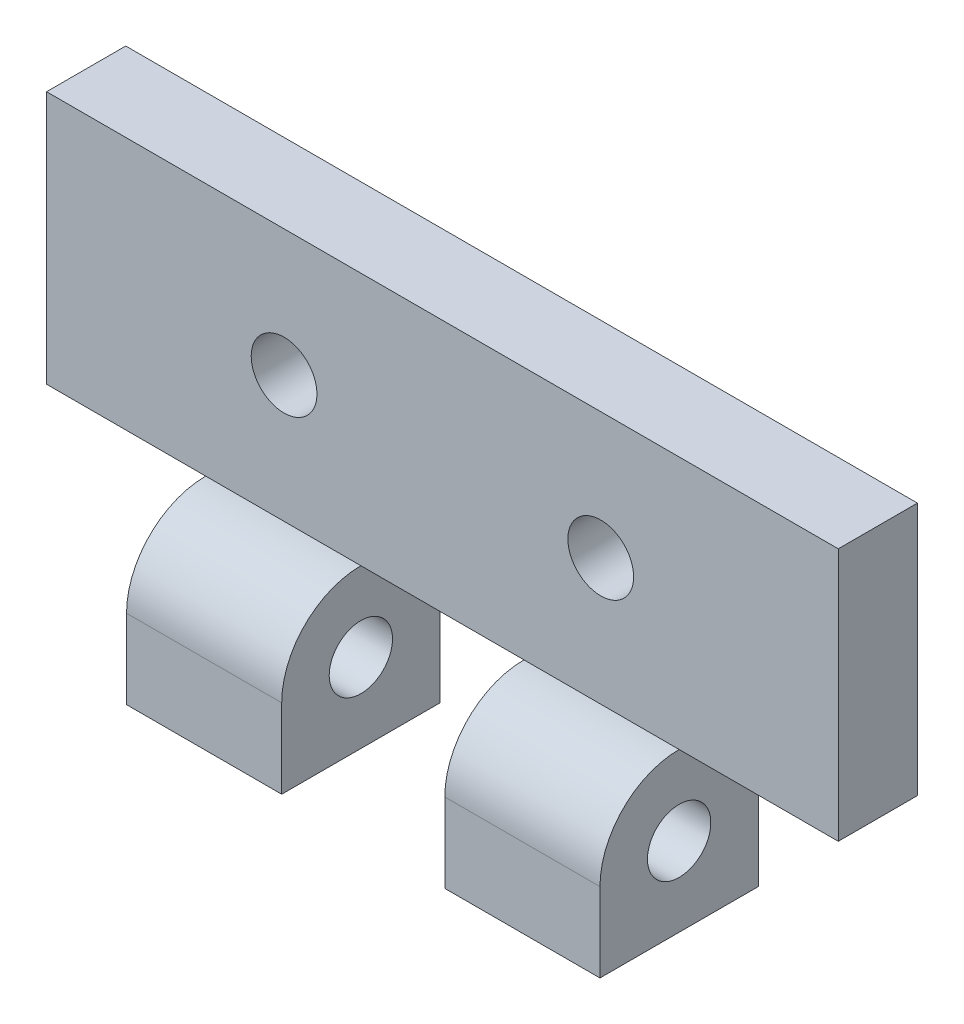
ISO-10303-21;
HEADER;
FILE_DESCRIPTION(('STEP AP214'),'2;1');
FILE_NAME('part.step','',(''),(''),'','','');
FILE_SCHEMA(('AUTOMOTIVE_DESIGN { 1 0 10303 214 1 1 1 1 }'));
ENDSEC;
DATA;
#1=APPLICATION_CONTEXT('core data for automotive mechanical design processes');
#2=APPLICATION_PROTOCOL_DEFINITION('international standard','automotive_design',2000,#1);
#3=PRODUCT_CONTEXT('',#1,'mechanical');
#4=PRODUCT('Part','Part','',(#3));
#5=PRODUCT_RELATED_PRODUCT_CATEGORY('part','',(#4));
#6=PRODUCT_DEFINITION_FORMATION('','',#4);
#7=PRODUCT_DEFINITION_CONTEXT('part definition',#1,'design');
#8=PRODUCT_DEFINITION('design','',#6,#7);
#9=PRODUCT_DEFINITION_SHAPE('','',#8);
#10=(LENGTH_UNIT() NAMED_UNIT(*) SI_UNIT(.MILLI.,.METRE.));
#11=(NAMED_UNIT(*) PLANE_ANGLE_UNIT() SI_UNIT($,.RADIAN.));
#12=(NAMED_UNIT(*) SI_UNIT($,.STERADIAN.) SOLID_ANGLE_UNIT());
#13=UNCERTAINTY_MEASURE_WITH_UNIT(LENGTH_MEASURE(1.E-05),#10,'distance_accuracy_value','');
#14=(GEOMETRIC_REPRESENTATION_CONTEXT(3) GLOBAL_UNCERTAINTY_ASSIGNED_CONTEXT((#13)) GLOBAL_UNIT_ASSIGNED_CONTEXT((#10,
#11,#12)) REPRESENTATION_CONTEXT('',''));
#15=CARTESIAN_POINT('',(0.,0.,0.));
#16=DIRECTION('',(0.,0.,1.));
#17=DIRECTION('',(1.,0.,0.));
#18=AXIS2_PLACEMENT_3D('',#15,#16,#17);
#19=CARTESIAN_POINT('',(-114.95,0.,-190.));
#20=DIRECTION('',(1.,0.,0.));
#21=DIRECTION('',(0.,0.,-1.));
#22=AXIS2_PLACEMENT_3D('',#19,#20,#21);
#23=PLANE('',#22);
#24=CARTESIAN_POINT('',(-114.95,5.,-195.));
#25=DIRECTION('',(-1.,0.,0.));
#26=DIRECTION('',(0.,0.,1.));
#27=AXIS2_PLACEMENT_3D('',#24,#25,#26);
#28=CIRCLE('',#27,2.);
#29=CARTESIAN_POINT('',(-114.95,5.,-193.));
#30=VERTEX_POINT('',#29);
#31=EDGE_CURVE('E211',#30,#30,#28,.T.);
#32=ORIENTED_EDGE('',*,*,#31,.F.);
#33=EDGE_LOOP('',(#32));
#34=FACE_BOUND('',#33,.T.);
#35=DIRECTION('',(0.,-1.,0.));
#36=VECTOR('',#35,1.);
#37=CARTESIAN_POINT('',(-114.95,0.,-190.));
#38=LINE('',#37,#36);
#39=CARTESIAN_POINT('',(-114.95,5.00000000000002,-190.));
#40=VERTEX_POINT('',#39);
#41=CARTESIAN_POINT('',(-114.95,0.,-190.));
#42=VERTEX_POINT('',#41);
#43=EDGE_CURVE('E124',#40,#42,#38,.T.);
#44=ORIENTED_EDGE('',*,*,#43,.F.);
#45=CARTESIAN_POINT('',(-114.95,5.,-195.));
#46=DIRECTION('',(1.,0.,0.));
#47=DIRECTION('',(0.,0.,-1.));
#48=AXIS2_PLACEMENT_3D('',#45,#46,#47);
#49=CIRCLE('',#48,5.);
#50=CARTESIAN_POINT('',(-114.95,9.99999999999999,-195.));
#51=VERTEX_POINT('',#50);
#52=EDGE_CURVE('E62',#40,#51,#49,.F.);
#53=ORIENTED_EDGE('',*,*,#52,.T.);
#54=DIRECTION('',(0.,0.,-1.));
#55=VECTOR('',#54,1.);
#56=CARTESIAN_POINT('',(-114.95,10.,-190.));
#57=LINE('',#56,#55);
#58=CARTESIAN_POINT('',(-114.95,10.,-200.));
#59=VERTEX_POINT('',#58);
#60=EDGE_CURVE('E206',#51,#59,#57,.T.);
#61=ORIENTED_EDGE('',*,*,#60,.T.);
#62=DIRECTION('',(0.,-1.,0.));
#63=VECTOR('',#62,1.);
#64=CARTESIAN_POINT('',(-114.95,0.,-200.));
#65=LINE('',#64,#63);
#66=CARTESIAN_POINT('',(-114.95,0.,-200.));
#67=VERTEX_POINT('',#66);
#68=EDGE_CURVE('E290',#59,#67,#65,.T.);
#69=ORIENTED_EDGE('',*,*,#68,.T.);
#70=DIRECTION('',(0.,0.,-1.));
#71=VECTOR('',#70,1.);
#72=CARTESIAN_POINT('',(-114.95,0.,-190.));
#73=LINE('',#72,#71);
#74=EDGE_CURVE('E203',#42,#67,#73,.T.);
#75=ORIENTED_EDGE('',*,*,#74,.F.);
#76=EDGE_LOOP('',(#44,#53,#61,#69,#75));
#77=FACE_BOUND('',#76,.T.);
#78=ADVANCED_FACE('F47',(#34,#77),#23,.F.);
#79=CARTESIAN_POINT('',(-105.15,10.,-190.));
#80=DIRECTION('',(-1.,0.,0.));
#81=DIRECTION('',(0.,0.,1.));
#82=AXIS2_PLACEMENT_3D('',#79,#80,#81);
#83=PLANE('',#82);
#84=CARTESIAN_POINT('',(-105.15,5.,-195.));
#85=DIRECTION('',(-1.,0.,0.));
#86=DIRECTION('',(0.,0.,1.));
#87=AXIS2_PLACEMENT_3D('',#84,#85,#86);
#88=CIRCLE('',#87,2.);
#89=CARTESIAN_POINT('',(-105.15,5.,-193.));
#90=VERTEX_POINT('',#89);
#91=EDGE_CURVE('E280',#90,#90,#88,.T.);
#92=ORIENTED_EDGE('',*,*,#91,.T.);
#93=EDGE_LOOP('',(#92));
#94=FACE_BOUND('',#93,.T.);
#95=DIRECTION('',(0.,0.,-1.));
#96=VECTOR('',#95,1.);
#97=CARTESIAN_POINT('',(-105.15,10.,-190.));
#98=LINE('',#97,#96);
#99=CARTESIAN_POINT('',(-105.15,10.,-195.));
#100=VERTEX_POINT('',#99);
#101=CARTESIAN_POINT('',(-105.15,10.,-200.));
#102=VERTEX_POINT('',#101);
#103=EDGE_CURVE('E198',#100,#102,#98,.T.);
#104=ORIENTED_EDGE('',*,*,#103,.F.);
#105=CARTESIAN_POINT('',(-105.15,5.00000000000002,-195.));
#106=DIRECTION('',(-1.,0.,0.));
#107=DIRECTION('',(0.,0.,1.));
#108=AXIS2_PLACEMENT_3D('',#105,#106,#107);
#109=CIRCLE('',#108,5.);
#110=CARTESIAN_POINT('',(-105.15,5.00000000000002,-190.));
#111=VERTEX_POINT('',#110);
#112=EDGE_CURVE('E243',#100,#111,#109,.F.);
#113=ORIENTED_EDGE('',*,*,#112,.T.);
#114=DIRECTION('',(0.,1.,0.));
#115=VECTOR('',#114,1.);
#116=CARTESIAN_POINT('',(-105.15,10.,-190.));
#117=LINE('',#116,#115);
#118=CARTESIAN_POINT('',(-105.15,0.,-190.));
#119=VERTEX_POINT('',#118);
#120=EDGE_CURVE('E277',#119,#111,#117,.T.);
#121=ORIENTED_EDGE('',*,*,#120,.F.);
#122=DIRECTION('',(0.,0.,-1.));
#123=VECTOR('',#122,1.);
#124=CARTESIAN_POINT('',(-105.15,0.,-190.));
#125=LINE('',#124,#123);
#126=CARTESIAN_POINT('',(-105.15,0.,-200.));
#127=VERTEX_POINT('',#126);
#128=EDGE_CURVE('E200',#119,#127,#125,.T.);
#129=ORIENTED_EDGE('',*,*,#128,.T.);
#130=DIRECTION('',(0.,1.,0.));
#131=VECTOR('',#130,1.);
#132=CARTESIAN_POINT('',(-105.15,10.,-200.));
#133=LINE('',#132,#131);
#134=EDGE_CURVE('E246',#127,#102,#133,.T.);
#135=ORIENTED_EDGE('',*,*,#134,.T.);
#136=EDGE_LOOP('',(#104,#113,#121,#129,#135));
#137=FACE_BOUND('',#136,.T.);
#138=ADVANCED_FACE('F241',(#94,#137),#83,.F.);
#139=CARTESIAN_POINT('',(-94.8499999999999,0.,-190.));
#140=DIRECTION('',(1.,0.,0.));
#141=DIRECTION('',(0.,0.,-1.));
#142=AXIS2_PLACEMENT_3D('',#139,#140,#141);
#143=PLANE('',#142);
#144=CARTESIAN_POINT('',(-94.8499999999999,5.,-195.));
#145=DIRECTION('',(1.,0.,0.));
#146=DIRECTION('',(0.,0.,-1.));
#147=AXIS2_PLACEMENT_3D('',#144,#145,#146);
#148=CIRCLE('',#147,2.);
#149=CARTESIAN_POINT('',(-94.8499999999999,5.,-197.));
#150=VERTEX_POINT('',#149);
#151=EDGE_CURVE('E210',#150,#150,#148,.T.);
#152=ORIENTED_EDGE('',*,*,#151,.T.);
#153=EDGE_LOOP('',(#152));
#154=FACE_BOUND('',#153,.T.);
#155=DIRECTION('',(0.,-1.,0.));
#156=VECTOR('',#155,1.);
#157=CARTESIAN_POINT('',(-94.8499999999999,0.,-190.));
#158=LINE('',#157,#156);
#159=CARTESIAN_POINT('',(-94.8499999999999,5.00000000000003,-190.));
#160=VERTEX_POINT('',#159);
#161=CARTESIAN_POINT('',(-94.8499999999999,0.,-190.));
#162=VERTEX_POINT('',#161);
#163=EDGE_CURVE('E284',#160,#162,#158,.T.);
#164=ORIENTED_EDGE('',*,*,#163,.F.);
#165=CARTESIAN_POINT('',(-94.8499999999999,5.00000000000003,-195.));
#166=DIRECTION('',(1.,0.,0.));
#167=DIRECTION('',(0.,0.,-1.));
#168=AXIS2_PLACEMENT_3D('',#165,#166,#167);
#169=CIRCLE('',#168,5.);
#170=CARTESIAN_POINT('',(-94.8499999999999,10.,-195.));
#171=VERTEX_POINT('',#170);
#172=EDGE_CURVE('E301',#160,#171,#169,.F.);
#173=ORIENTED_EDGE('',*,*,#172,.T.);
#174=DIRECTION('',(0.,0.,-1.));
#175=VECTOR('',#174,1.);
#176=CARTESIAN_POINT('',(-94.8499999999999,10.,-190.));
#177=LINE('',#176,#175);
#178=CARTESIAN_POINT('',(-94.8499999999999,10.,-200.));
#179=VERTEX_POINT('',#178);
#180=EDGE_CURVE('E196',#171,#179,#177,.T.);
#181=ORIENTED_EDGE('',*,*,#180,.T.);
#182=DIRECTION('',(0.,-1.,0.));
#183=VECTOR('',#182,1.);
#184=CARTESIAN_POINT('',(-94.8499999999999,0.,-200.));
#185=LINE('',#184,#183);
#186=CARTESIAN_POINT('',(-94.8499999999999,0.,-200.));
#187=VERTEX_POINT('',#186);
#188=EDGE_CURVE('E258',#179,#187,#185,.T.);
#189=ORIENTED_EDGE('',*,*,#188,.T.);
#190=DIRECTION('',(0.,0.,-1.));
#191=VECTOR('',#190,1.);
#192=CARTESIAN_POINT('',(-94.8499999999999,0.,-190.));
#193=LINE('',#192,#191);
#194=EDGE_CURVE('E193',#162,#187,#193,.T.);
#195=ORIENTED_EDGE('',*,*,#194,.F.);
#196=EDGE_LOOP('',(#164,#173,#181,#189,#195));
#197=FACE_BOUND('',#196,.T.);
#198=ADVANCED_FACE('F334',(#154,#197),#143,.F.);
#199=CARTESIAN_POINT('',(-85.0499999999999,10.,-190.));
#200=DIRECTION('',(-1.,0.,0.));
#201=DIRECTION('',(0.,0.,1.));
#202=AXIS2_PLACEMENT_3D('',#199,#200,#201);
#203=PLANE('',#202);
#204=CARTESIAN_POINT('',(-85.0499999999999,5.,-195.));
#205=DIRECTION('',(-1.,0.,0.));
#206=DIRECTION('',(0.,0.,1.));
#207=AXIS2_PLACEMENT_3D('',#204,#205,#206);
#208=CIRCLE('',#207,2.);
#209=CARTESIAN_POINT('',(-85.0499999999999,5.,-193.));
#210=VERTEX_POINT('',#209);
#211=EDGE_CURVE('E208',#210,#210,#208,.T.);
#212=ORIENTED_EDGE('',*,*,#211,.T.);
#213=EDGE_LOOP('',(#212));
#214=FACE_BOUND('',#213,.T.);
#215=DIRECTION('',(0.,0.,-1.));
#216=VECTOR('',#215,1.);
#217=CARTESIAN_POINT('',(-85.0499999999999,10.,-190.));
#218=LINE('',#217,#216);
#219=CARTESIAN_POINT('',(-85.0499999999999,10.,-195.));
#220=VERTEX_POINT('',#219);
#221=CARTESIAN_POINT('',(-85.0499999999999,10.,-200.));
#222=VERTEX_POINT('',#221);
#223=EDGE_CURVE('E188',#220,#222,#218,.T.);
#224=ORIENTED_EDGE('',*,*,#223,.F.);
#225=CARTESIAN_POINT('',(-85.0499999999999,5.00000000000005,-195.));
#226=DIRECTION('',(-1.,0.,0.));
#227=DIRECTION('',(0.,0.,1.));
#228=AXIS2_PLACEMENT_3D('',#225,#226,#227);
#229=CIRCLE('',#228,5.);
#230=CARTESIAN_POINT('',(-85.0499999999999,5.00000000000005,-190.));
#231=VERTEX_POINT('',#230);
#232=EDGE_CURVE('E377',#220,#231,#229,.F.);
#233=ORIENTED_EDGE('',*,*,#232,.T.);
#234=DIRECTION('',(0.,1.,0.));
#235=VECTOR('',#234,1.);
#236=CARTESIAN_POINT('',(-85.0499999999999,10.,-190.));
#237=LINE('',#236,#235);
#238=CARTESIAN_POINT('',(-85.0499999999999,0.,-190.));
#239=VERTEX_POINT('',#238);
#240=EDGE_CURVE('E183',#239,#231,#237,.T.);
#241=ORIENTED_EDGE('',*,*,#240,.F.);
#242=DIRECTION('',(0.,0.,-1.));
#243=VECTOR('',#242,1.);
#244=CARTESIAN_POINT('',(-85.0499999999999,0.,-190.));
#245=LINE('',#244,#243);
#246=CARTESIAN_POINT('',(-85.0499999999999,0.,-200.));
#247=VERTEX_POINT('',#246);
#248=EDGE_CURVE('E190',#239,#247,#245,.T.);
#249=ORIENTED_EDGE('',*,*,#248,.T.);
#250=DIRECTION('',(0.,1.,0.));
#251=VECTOR('',#250,1.);
#252=CARTESIAN_POINT('',(-85.0499999999999,10.,-200.));
#253=LINE('',#252,#251);
#254=EDGE_CURVE('E265',#247,#222,#253,.T.);
#255=ORIENTED_EDGE('',*,*,#254,.T.);
#256=EDGE_LOOP('',(#224,#233,#241,#249,#255));
#257=FACE_BOUND('',#256,.T.);
#258=ADVANCED_FACE('F345',(#214,#257),#203,.F.);
#259=CARTESIAN_POINT('',(0.,0.,-190.));
#260=DIRECTION('',(0.,0.,-1.));
#261=DIRECTION('',(-1.,0.,0.));
#262=AXIS2_PLACEMENT_3D('',#259,#260,#261);
#263=PLANE('',#262);
#264=ORIENTED_EDGE('',*,*,#240,.T.);
#265=DIRECTION('',(-1.,0.,0.));
#266=VECTOR('',#265,1.);
#267=CARTESIAN_POINT('',(0.,5.0000000000002,-190.));
#268=LINE('',#267,#266);
#269=EDGE_CURVE('E11',#231,#160,#268,.T.);
#270=ORIENTED_EDGE('',*,*,#269,.T.);
#271=ORIENTED_EDGE('',*,*,#163,.T.);
#272=DIRECTION('',(1.,0.,0.));
#273=VECTOR('',#272,1.);
#274=CARTESIAN_POINT('',(-85.0499999999999,0.,-190.));
#275=LINE('',#274,#273);
#276=EDGE_CURVE('E71',#162,#239,#275,.T.);
#277=ORIENTED_EDGE('',*,*,#276,.T.);
#278=EDGE_LOOP('',(#264,#270,#271,#277));
#279=FACE_BOUND('',#278,.T.);
#280=ADVANCED_FACE('F352',(#279),#263,.F.);
#281=CARTESIAN_POINT('',(-114.95,10.,-190.));
#282=DIRECTION('',(0.,1.,0.));
#283=DIRECTION('',(0.,0.,1.));
#284=AXIS2_PLACEMENT_3D('',#281,#282,#283);
#285=PLANE('',#284);
#286=ORIENTED_EDGE('',*,*,#60,.F.);
#287=DIRECTION('',(-1.,0.,0.));
#288=VECTOR('',#287,1.);
#289=CARTESIAN_POINT('',(-71.,10.0000000000001,-195.));
#290=LINE('',#289,#288);
#291=CARTESIAN_POINT('',(-125.,9.99999999999997,-195.));
#292=VERTEX_POINT('',#291);
#293=EDGE_CURVE('E168',#51,#292,#290,.T.);
#294=ORIENTED_EDGE('',*,*,#293,.T.);
#295=DIRECTION('',(0.,0.,-1.));
#296=VECTOR('',#295,1.);
#297=CARTESIAN_POINT('',(-125.,10.,-190.));
#298=LINE('',#297,#296);
#299=CARTESIAN_POINT('',(-125.,10.,-200.));
#300=VERTEX_POINT('',#299);
#301=EDGE_CURVE('E117',#292,#300,#298,.T.);
#302=ORIENTED_EDGE('',*,*,#301,.T.);
#303=DIRECTION('',(1.,0.,0.));
#304=VECTOR('',#303,1.);
#305=CARTESIAN_POINT('',(-114.95,10.,-200.));
#306=LINE('',#305,#304);
#307=EDGE_CURVE('E288',#300,#59,#306,.T.);
#308=ORIENTED_EDGE('',*,*,#307,.T.);
#309=EDGE_LOOP('',(#286,#294,#302,#308));
#310=FACE_BOUND('',#309,.T.);
#311=ADVANCED_FACE('F49',(#310),#285,.F.);
#312=CARTESIAN_POINT('',(-105.15,0.,-190.));
#313=DIRECTION('',(0.,1.,0.));
#314=DIRECTION('',(-1.,0.,0.));
#315=AXIS2_PLACEMENT_3D('',#312,#313,#314);
#316=PLANE('',#315);
#317=DIRECTION('',(1.,0.,0.));
#318=VECTOR('',#317,1.);
#319=CARTESIAN_POINT('',(-105.15,0.,-200.));
#320=LINE('',#319,#318);
#321=EDGE_CURVE('E252',#67,#127,#320,.T.);
#322=ORIENTED_EDGE('',*,*,#321,.T.);
#323=ORIENTED_EDGE('',*,*,#128,.F.);
#324=DIRECTION('',(1.,0.,0.));
#325=VECTOR('',#324,1.);
#326=CARTESIAN_POINT('',(-105.15,0.,-190.));
#327=LINE('',#326,#325);
#328=EDGE_CURVE('E275',#42,#119,#327,.T.);
#329=ORIENTED_EDGE('',*,*,#328,.F.);
#330=ORIENTED_EDGE('',*,*,#74,.T.);
#331=EDGE_LOOP('',(#322,#323,#329,#330));
#332=FACE_BOUND('',#331,.T.);
#333=ADVANCED_FACE('F292',(#332),#316,.F.);
#334=CARTESIAN_POINT('',(-94.8499999999999,10.,-190.));
#335=DIRECTION('',(0.,1.,0.));
#336=DIRECTION('',(0.,0.,1.));
#337=AXIS2_PLACEMENT_3D('',#334,#335,#336);
#338=PLANE('',#337);
#339=ORIENTED_EDGE('',*,*,#180,.F.);
#340=EDGE_CURVE('E227',#171,#100,#290,.T.);
#341=ORIENTED_EDGE('',*,*,#340,.T.);
#342=ORIENTED_EDGE('',*,*,#103,.T.);
#343=DIRECTION('',(1.,0.,0.));
#344=VECTOR('',#343,1.);
#345=CARTESIAN_POINT('',(-94.8499999999999,10.,-200.));
#346=LINE('',#345,#344);
#347=EDGE_CURVE('E251',#102,#179,#346,.T.);
#348=ORIENTED_EDGE('',*,*,#347,.T.);
#349=EDGE_LOOP('',(#339,#341,#342,#348));
#350=FACE_BOUND('',#349,.T.);
#351=ADVANCED_FACE('F235',(#350),#338,.F.);
#352=CARTESIAN_POINT('',(-85.0499999999999,0.,-190.));
#353=DIRECTION('',(0.,1.,0.));
#354=DIRECTION('',(-1.,0.,0.));
#355=AXIS2_PLACEMENT_3D('',#352,#353,#354);
#356=PLANE('',#355);
#357=DIRECTION('',(1.,0.,0.));
#358=VECTOR('',#357,1.);
#359=CARTESIAN_POINT('',(-85.0499999999999,0.,-200.));
#360=LINE('',#359,#358);
#361=EDGE_CURVE('E260',#187,#247,#360,.T.);
#362=ORIENTED_EDGE('',*,*,#361,.T.);
#363=ORIENTED_EDGE('',*,*,#248,.F.);
#364=ORIENTED_EDGE('',*,*,#276,.F.);
#365=ORIENTED_EDGE('',*,*,#194,.T.);
#366=EDGE_LOOP('',(#362,#363,#364,#365));
#367=FACE_BOUND('',#366,.T.);
#368=ADVANCED_FACE('F342',(#367),#356,.F.);
#369=CARTESIAN_POINT('',(-74.9999999999999,10.,-190.));
#370=DIRECTION('',(0.,1.,0.));
#371=DIRECTION('',(0.,0.,1.));
#372=AXIS2_PLACEMENT_3D('',#369,#370,#371);
#373=PLANE('',#372);
#374=DIRECTION('',(0.,0.,-1.));
#375=VECTOR('',#374,1.);
#376=CARTESIAN_POINT('',(-74.9999999999999,10.,-190.));
#377=LINE('',#376,#375);
#378=CARTESIAN_POINT('',(-74.9999999999999,10.0000000000001,-195.));
#379=VERTEX_POINT('',#378);
#380=CARTESIAN_POINT('',(-74.9999999999999,10.,-200.));
#381=VERTEX_POINT('',#380);
#382=EDGE_CURVE('E181',#379,#381,#377,.T.);
#383=ORIENTED_EDGE('',*,*,#382,.F.);
#384=EDGE_CURVE('E215',#379,#220,#290,.T.);
#385=ORIENTED_EDGE('',*,*,#384,.T.);
#386=ORIENTED_EDGE('',*,*,#223,.T.);
#387=DIRECTION('',(1.,0.,0.));
#388=VECTOR('',#387,1.);
#389=CARTESIAN_POINT('',(-74.9999999999999,10.,-200.));
#390=LINE('',#389,#388);
#391=EDGE_CURVE('E268',#222,#381,#390,.T.);
#392=ORIENTED_EDGE('',*,*,#391,.T.);
#393=EDGE_LOOP('',(#383,#385,#386,#392));
#394=FACE_BOUND('',#393,.T.);
#395=ADVANCED_FACE('F348',(#394),#373,.F.);
#396=CARTESIAN_POINT('',(-74.9999999999999,10.,-190.));
#397=DIRECTION('',(-1.,0.,0.));
#398=DIRECTION('',(0.,-1.,0.));
#399=AXIS2_PLACEMENT_3D('',#396,#397,#398);
#400=PLANE('',#399);
#401=DIRECTION('',(0.,0.,-1.));
#402=VECTOR('',#401,1.);
#403=CARTESIAN_POINT('',(-75.,26.,-190.));
#404=LINE('',#403,#402);
#405=CARTESIAN_POINT('',(-75.,26.0000000000001,-195.));
#406=VERTEX_POINT('',#405);
#407=CARTESIAN_POINT('',(-75.,26.,-200.));
#408=VERTEX_POINT('',#407);
#409=EDGE_CURVE('E179',#406,#408,#404,.T.);
#410=ORIENTED_EDGE('',*,*,#409,.F.);
#411=DIRECTION('',(0.,-1.,0.));
#412=VECTOR('',#411,1.);
#413=CARTESIAN_POINT('',(-74.9999999999999,10.,-195.));
#414=LINE('',#413,#412);
#415=EDGE_CURVE('E164',#406,#379,#414,.T.);
#416=ORIENTED_EDGE('',*,*,#415,.T.);
#417=ORIENTED_EDGE('',*,*,#382,.T.);
#418=DIRECTION('',(0.,1.,0.));
#419=VECTOR('',#418,1.);
#420=CARTESIAN_POINT('',(-74.9999999999999,10.,-200.));
#421=LINE('',#420,#419);
#422=EDGE_CURVE('E271',#381,#408,#421,.T.);
#423=ORIENTED_EDGE('',*,*,#422,.T.);
#424=EDGE_LOOP('',(#410,#416,#417,#423));
#425=FACE_BOUND('',#424,.T.);
#426=ADVANCED_FACE('F356',(#425),#400,.F.);
#427=CARTESIAN_POINT('',(-125.,26.,-190.));
#428=DIRECTION('',(0.,-1.,0.));
#429=DIRECTION('',(0.,0.,-1.));
#430=AXIS2_PLACEMENT_3D('',#427,#428,#429);
#431=PLANE('',#430);
#432=DIRECTION('',(0.,0.,-1.));
#433=VECTOR('',#432,1.);
#434=CARTESIAN_POINT('',(-125.,26.,-190.));
#435=LINE('',#434,#433);
#436=CARTESIAN_POINT('',(-125.,26.,-195.));
#437=VERTEX_POINT('',#436);
#438=CARTESIAN_POINT('',(-125.,26.,-200.));
#439=VERTEX_POINT('',#438);
#440=EDGE_CURVE('E172',#437,#439,#435,.T.);
#441=ORIENTED_EDGE('',*,*,#440,.F.);
#442=DIRECTION('',(-1.,0.,0.));
#443=VECTOR('',#442,1.);
#444=CARTESIAN_POINT('',(-71.,26.0000000000001,-195.));
#445=LINE('',#444,#443);
#446=EDGE_CURVE('E159',#406,#437,#445,.T.);
#447=ORIENTED_EDGE('',*,*,#446,.F.);
#448=ORIENTED_EDGE('',*,*,#409,.T.);
#449=DIRECTION('',(-1.,0.,0.));
#450=VECTOR('',#449,1.);
#451=CARTESIAN_POINT('',(-125.,26.,-200.));
#452=LINE('',#451,#450);
#453=EDGE_CURVE('E177',#408,#439,#452,.T.);
#454=ORIENTED_EDGE('',*,*,#453,.T.);
#455=EDGE_LOOP('',(#441,#447,#448,#454));
#456=FACE_BOUND('',#455,.T.);
#457=ADVANCED_FACE('F175',(#456),#431,.F.);
#458=CARTESIAN_POINT('',(-125.,10.,-190.));
#459=DIRECTION('',(1.,0.,0.));
#460=DIRECTION('',(0.,1.,0.));
#461=AXIS2_PLACEMENT_3D('',#458,#459,#460);
#462=PLANE('',#461);
#463=ORIENTED_EDGE('',*,*,#301,.F.);
#464=DIRECTION('',(0.,-1.,0.));
#465=VECTOR('',#464,1.);
#466=CARTESIAN_POINT('',(-125.,9.99999999999997,-195.));
#467=LINE('',#466,#465);
#468=EDGE_CURVE('E162',#437,#292,#467,.T.);
#469=ORIENTED_EDGE('',*,*,#468,.F.);
#470=ORIENTED_EDGE('',*,*,#440,.T.);
#471=DIRECTION('',(0.,-1.,0.));
#472=VECTOR('',#471,1.);
#473=CARTESIAN_POINT('',(-125.,10.,-200.));
#474=LINE('',#473,#472);
#475=EDGE_CURVE('E274',#439,#300,#474,.T.);
#476=ORIENTED_EDGE('',*,*,#475,.T.);
#477=EDGE_LOOP('',(#463,#469,#470,#476));
#478=FACE_BOUND('',#477,.T.);
#479=ADVANCED_FACE('F171',(#478),#462,.F.);
#480=ORIENTED_EDGE('',*,*,#120,.T.);
#481=EDGE_CURVE('E51',#111,#40,#268,.T.);
#482=ORIENTED_EDGE('',*,*,#481,.T.);
#483=ORIENTED_EDGE('',*,*,#43,.T.);
#484=ORIENTED_EDGE('',*,*,#328,.T.);
#485=EDGE_LOOP('',(#480,#482,#483,#484));
#486=FACE_BOUND('',#485,.T.);
#487=ADVANCED_FACE('F364',(#486),#263,.F.);
#488=CARTESIAN_POINT('',(0.,0.,-200.));
#489=DIRECTION('',(0.,0.,-1.));
#490=DIRECTION('',(-1.,0.,0.));
#491=AXIS2_PLACEMENT_3D('',#488,#489,#490);
#492=PLANE('',#491);
#493=CARTESIAN_POINT('',(-89.9999999999999,18.,-200.));
#494=DIRECTION('',(0.,0.,-1.));
#495=DIRECTION('',(-1.,0.,0.));
#496=AXIS2_PLACEMENT_3D('',#493,#494,#495);
#497=CIRCLE('',#496,2.07645);
#498=CARTESIAN_POINT('',(-92.0764499999999,18.,-200.));
#499=VERTEX_POINT('',#498);
#500=EDGE_CURVE('E299',#499,#499,#497,.T.);
#501=ORIENTED_EDGE('',*,*,#500,.F.);
#502=EDGE_LOOP('',(#501));
#503=FACE_BOUND('',#502,.T.);
#504=CARTESIAN_POINT('',(-110.,18.,-200.));
#505=DIRECTION('',(0.,0.,-1.));
#506=DIRECTION('',(-1.,0.,0.));
#507=AXIS2_PLACEMENT_3D('',#504,#505,#506);
#508=CIRCLE('',#507,2.07645);
#509=CARTESIAN_POINT('',(-112.07645,18.,-200.));
#510=VERTEX_POINT('',#509);
#511=EDGE_CURVE('E296',#510,#510,#508,.T.);
#512=ORIENTED_EDGE('',*,*,#511,.F.);
#513=EDGE_LOOP('',(#512));
#514=FACE_BOUND('',#513,.T.);
#515=ORIENTED_EDGE('',*,*,#307,.F.);
#516=ORIENTED_EDGE('',*,*,#475,.F.);
#517=ORIENTED_EDGE('',*,*,#453,.F.);
#518=ORIENTED_EDGE('',*,*,#422,.F.);
#519=ORIENTED_EDGE('',*,*,#391,.F.);
#520=ORIENTED_EDGE('',*,*,#254,.F.);
#521=ORIENTED_EDGE('',*,*,#361,.F.);
#522=ORIENTED_EDGE('',*,*,#188,.F.);
#523=ORIENTED_EDGE('',*,*,#347,.F.);
#524=ORIENTED_EDGE('',*,*,#134,.F.);
#525=ORIENTED_EDGE('',*,*,#321,.F.);
#526=ORIENTED_EDGE('',*,*,#68,.F.);
#527=EDGE_LOOP('',(#515,#516,#517,#518,#519,#520,#521,#522,#523,#524,#525,#526));
#528=FACE_BOUND('',#527,.T.);
#529=ADVANCED_FACE('F256',(#503,#514,#528),#492,.T.);
#530=CARTESIAN_POINT('',(-71.,5.,-195.));
#531=DIRECTION('',(-1.,0.,0.));
#532=DIRECTION('',(0.,0.,1.));
#533=AXIS2_PLACEMENT_3D('',#530,#531,#532);
#534=CYLINDRICAL_SURFACE('',#533,2.);
#535=ORIENTED_EDGE('',*,*,#211,.F.);
#536=EDGE_LOOP('',(#535));
#537=FACE_BOUND('',#536,.T.);
#538=ORIENTED_EDGE('',*,*,#151,.F.);
#539=EDGE_LOOP('',(#538));
#540=FACE_BOUND('',#539,.T.);
#541=ADVANCED_FACE('F318',(#537,#540),#534,.F.);
#542=ORIENTED_EDGE('',*,*,#31,.T.);
#543=EDGE_LOOP('',(#542));
#544=FACE_BOUND('',#543,.T.);
#545=ORIENTED_EDGE('',*,*,#91,.F.);
#546=EDGE_LOOP('',(#545));
#547=FACE_BOUND('',#546,.T.);
#548=ADVANCED_FACE('F315',(#544,#547),#534,.F.);
#549=CARTESIAN_POINT('',(-110.,18.,-190.));
#550=DIRECTION('',(0.,0.,-1.));
#551=DIRECTION('',(-1.,0.,0.));
#552=AXIS2_PLACEMENT_3D('',#549,#550,#551);
#553=CYLINDRICAL_SURFACE('',#552,2.07645);
#554=CARTESIAN_POINT('',(-110.,18.,-195.));
#555=DIRECTION('',(0.,0.,-1.));
#556=DIRECTION('',(-1.,0.,0.));
#557=AXIS2_PLACEMENT_3D('',#554,#555,#556);
#558=CIRCLE('',#557,2.07645);
#559=CARTESIAN_POINT('',(-112.07645,18.,-195.));
#560=VERTEX_POINT('',#559);
#561=EDGE_CURVE('E214',#560,#560,#558,.F.);
#562=ORIENTED_EDGE('',*,*,#561,.T.);
#563=EDGE_LOOP('',(#562));
#564=FACE_BOUND('',#563,.T.);
#565=ORIENTED_EDGE('',*,*,#511,.T.);
#566=EDGE_LOOP('',(#565));
#567=FACE_BOUND('',#566,.T.);
#568=ADVANCED_FACE('F317',(#564,#567),#553,.F.);
#569=CARTESIAN_POINT('',(-89.9999999999999,18.,-190.));
#570=DIRECTION('',(0.,0.,-1.));
#571=DIRECTION('',(-1.,0.,0.));
#572=AXIS2_PLACEMENT_3D('',#569,#570,#571);
#573=CYLINDRICAL_SURFACE('',#572,2.07645);
#574=CARTESIAN_POINT('',(-89.9999999999999,18.,-195.));
#575=DIRECTION('',(0.,0.,-1.));
#576=DIRECTION('',(-1.,0.,0.));
#577=AXIS2_PLACEMENT_3D('',#574,#575,#576);
#578=CIRCLE('',#577,2.07645);
#579=CARTESIAN_POINT('',(-92.0764499999999,18.,-195.));
#580=VERTEX_POINT('',#579);
#581=EDGE_CURVE('E212',#580,#580,#578,.F.);
#582=ORIENTED_EDGE('',*,*,#581,.T.);
#583=EDGE_LOOP('',(#582));
#584=FACE_BOUND('',#583,.T.);
#585=ORIENTED_EDGE('',*,*,#500,.T.);
#586=EDGE_LOOP('',(#585));
#587=FACE_BOUND('',#586,.T.);
#588=ADVANCED_FACE('F324',(#584,#587),#573,.F.);
#589=CARTESIAN_POINT('',(-71.,5.00000000000008,-195.));
#590=DIRECTION('',(-1.,0.,0.));
#591=DIRECTION('',(0.,-1.,0.));
#592=AXIS2_PLACEMENT_3D('',#589,#590,#591);
#593=CYLINDRICAL_SURFACE('',#592,5.);
#594=ORIENTED_EDGE('',*,*,#481,.F.);
#595=ORIENTED_EDGE('',*,*,#112,.F.);
#596=EDGE_CURVE('E228',#100,#51,#290,.T.);
#597=ORIENTED_EDGE('',*,*,#596,.T.);
#598=ORIENTED_EDGE('',*,*,#52,.F.);
#599=EDGE_LOOP('',(#594,#595,#597,#598));
#600=FACE_BOUND('',#599,.T.);
#601=ADVANCED_FACE('F388',(#600),#593,.T.);
#602=ORIENTED_EDGE('',*,*,#269,.F.);
#603=ORIENTED_EDGE('',*,*,#232,.F.);
#604=EDGE_CURVE('E221',#220,#171,#290,.T.);
#605=ORIENTED_EDGE('',*,*,#604,.T.);
#606=ORIENTED_EDGE('',*,*,#172,.F.);
#607=EDGE_LOOP('',(#602,#603,#605,#606));
#608=FACE_BOUND('',#607,.T.);
#609=ADVANCED_FACE('F386',(#608),#593,.T.);
#610=CARTESIAN_POINT('',(-71.,10.0000000000001,-195.));
#611=DIRECTION('',(0.,0.,-1.));
#612=DIRECTION('',(-1.,0.,0.));
#613=AXIS2_PLACEMENT_3D('',#610,#611,#612);
#614=PLANE('',#613);
#615=ORIENTED_EDGE('',*,*,#581,.F.);
#616=EDGE_LOOP('',(#615));
#617=FACE_BOUND('',#616,.T.);
#618=ORIENTED_EDGE('',*,*,#561,.F.);
#619=EDGE_LOOP('',(#618));
#620=FACE_BOUND('',#619,.T.);
#621=ORIENTED_EDGE('',*,*,#446,.T.);
#622=ORIENTED_EDGE('',*,*,#468,.T.);
#623=ORIENTED_EDGE('',*,*,#293,.F.);
#624=ORIENTED_EDGE('',*,*,#596,.F.);
#625=ORIENTED_EDGE('',*,*,#340,.F.);
#626=ORIENTED_EDGE('',*,*,#604,.F.);
#627=ORIENTED_EDGE('',*,*,#384,.F.);
#628=ORIENTED_EDGE('',*,*,#415,.F.);
#629=EDGE_LOOP('',(#621,#622,#623,#624,#625,#626,#627,#628));
#630=FACE_BOUND('',#629,.T.);
#631=ADVANCED_FACE('F161',(#617,#620,#630),#614,.F.);
#632=CLOSED_SHELL('',(#78,#138,#198,#258,#280,#311,#333,#351,#368,#395,#426,#457,#479,#487,#529,
#541,#548,#568,#588,#601,#609,#631));
#633=MANIFOLD_SOLID_BREP('B2',#632);
#634=ADVANCED_BREP_SHAPE_REPRESENTATION('',(#18,#633),#14);
#635=SHAPE_DEFINITION_REPRESENTATION(#9,#634);
ENDSEC;
END-ISO-10303-21;
